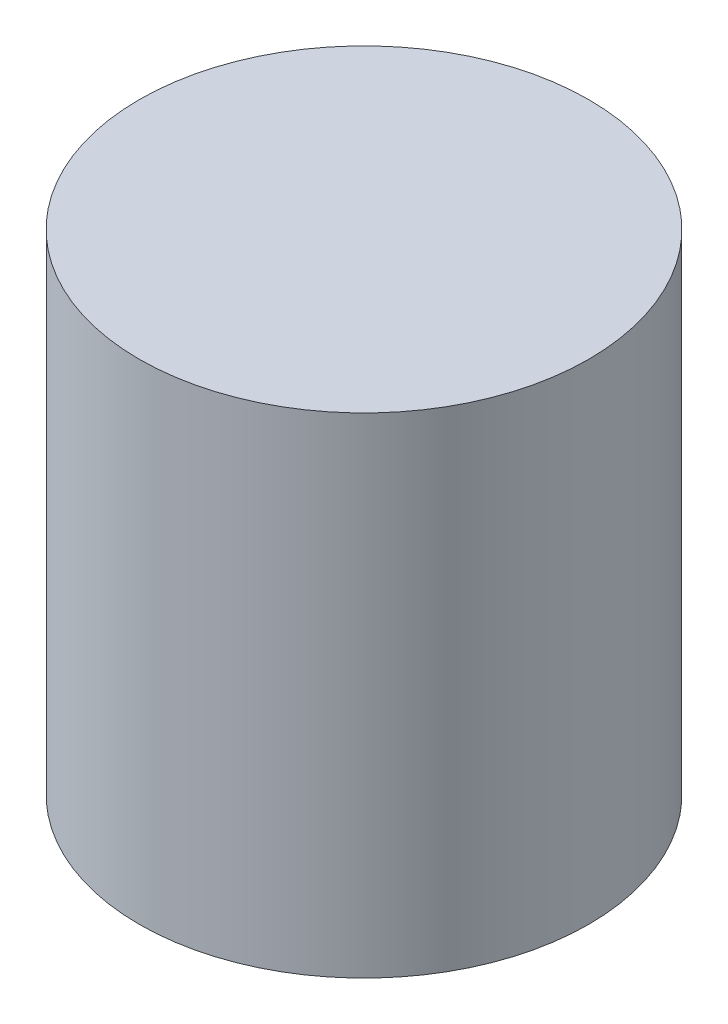
ISO-10303-21;
HEADER;
FILE_DESCRIPTION(('STEP AP214'),'2;1');
FILE_NAME('part.step','',(''),(''),'','','');
FILE_SCHEMA(('AUTOMOTIVE_DESIGN { 1 0 10303 214 1 1 1 1 }'));
ENDSEC;
DATA;
#1=APPLICATION_CONTEXT('core data for automotive mechanical design processes');
#2=APPLICATION_PROTOCOL_DEFINITION('international standard','automotive_design',2000,#1);
#3=PRODUCT_CONTEXT('',#1,'mechanical');
#4=PRODUCT('Part','Part','',(#3));
#5=PRODUCT_RELATED_PRODUCT_CATEGORY('part','',(#4));
#6=PRODUCT_DEFINITION_FORMATION('','',#4);
#7=PRODUCT_DEFINITION_CONTEXT('part definition',#1,'design');
#8=PRODUCT_DEFINITION('design','',#6,#7);
#9=PRODUCT_DEFINITION_SHAPE('','',#8);
#10=(LENGTH_UNIT() NAMED_UNIT(*) SI_UNIT(.MILLI.,.METRE.));
#11=(NAMED_UNIT(*) PLANE_ANGLE_UNIT() SI_UNIT($,.RADIAN.));
#12=(NAMED_UNIT(*) SI_UNIT($,.STERADIAN.) SOLID_ANGLE_UNIT());
#13=UNCERTAINTY_MEASURE_WITH_UNIT(LENGTH_MEASURE(1.E-05),#10,'distance_accuracy_value','');
#14=(GEOMETRIC_REPRESENTATION_CONTEXT(3) GLOBAL_UNCERTAINTY_ASSIGNED_CONTEXT((#13)) GLOBAL_UNIT_ASSIGNED_CONTEXT((#10,
#11,#12)) REPRESENTATION_CONTEXT('',''));
#15=CARTESIAN_POINT('',(0.,0.,0.));
#16=DIRECTION('',(0.,0.,1.));
#17=DIRECTION('',(1.,0.,0.));
#18=AXIS2_PLACEMENT_3D('',#15,#16,#17);
#19=CARTESIAN_POINT('',(-2.05,3.7,0.));
#20=DIRECTION('',(-1.,0.,0.));
#21=DIRECTION('',(0.,0.,1.));
#22=AXIS2_PLACEMENT_3D('',#19,#20,#21);
#23=PLANE('',#22);
#24=DIRECTION('',(0.,0.,-1.));
#25=VECTOR('',#24,1.);
#26=CARTESIAN_POINT('',(-2.05,0.,0.));
#27=LINE('',#26,#25);
#28=CARTESIAN_POINT('',(-2.05,0.,0.585));
#29=VERTEX_POINT('',#28);
#30=CARTESIAN_POINT('',(-2.05,0.,-0.585));
#31=VERTEX_POINT('',#30);
#32=EDGE_CURVE('E165',#29,#31,#27,.T.);
#33=ORIENTED_EDGE('',*,*,#32,.T.);
#34=DIRECTION('',(0.,-1.,0.));
#35=VECTOR('',#34,1.);
#36=CARTESIAN_POINT('',(-2.05,3.7,-0.585));
#37=LINE('',#36,#35);
#38=CARTESIAN_POINT('',(-2.05,3.7,-0.585));
#39=VERTEX_POINT('',#38);
#40=EDGE_CURVE('E11',#39,#31,#37,.T.);
#41=ORIENTED_EDGE('',*,*,#40,.F.);
#42=DIRECTION('',(0.,0.,-1.));
#43=VECTOR('',#42,1.);
#44=CARTESIAN_POINT('',(-2.05,3.7,0.));
#45=LINE('',#44,#43);
#46=CARTESIAN_POINT('',(-2.05,3.7,0.585));
#47=VERTEX_POINT('',#46);
#48=EDGE_CURVE('E191',#47,#39,#45,.T.);
#49=ORIENTED_EDGE('',*,*,#48,.F.);
#50=DIRECTION('',(0.,-1.,0.));
#51=VECTOR('',#50,1.);
#52=CARTESIAN_POINT('',(-2.05,3.7,0.585));
#53=LINE('',#52,#51);
#54=EDGE_CURVE('E164',#47,#29,#53,.T.);
#55=ORIENTED_EDGE('',*,*,#54,.T.);
#56=EDGE_LOOP('',(#33,#41,#49,#55));
#57=FACE_BOUND('',#56,.T.);
#58=ADVANCED_FACE('F34',(#57),#23,.F.);
#59=CARTESIAN_POINT('',(0.,3.7,-0.585));
#60=DIRECTION('',(0.,0.,-1.));
#61=DIRECTION('',(-1.,0.,0.));
#62=AXIS2_PLACEMENT_3D('',#59,#60,#61);
#63=PLANE('',#62);
#64=DIRECTION('',(1.,0.,0.));
#65=VECTOR('',#64,1.);
#66=CARTESIAN_POINT('',(0.,0.,-0.585));
#67=LINE('',#66,#65);
#68=CARTESIAN_POINT('',(-0.585,0.,-0.585));
#69=VERTEX_POINT('',#68);
#70=EDGE_CURVE('E168',#31,#69,#67,.T.);
#71=ORIENTED_EDGE('',*,*,#70,.T.);
#72=DIRECTION('',(0.,-1.,0.));
#73=VECTOR('',#72,1.);
#74=CARTESIAN_POINT('',(-0.585,3.7,-0.585));
#75=LINE('',#74,#73);
#76=CARTESIAN_POINT('',(-0.585,3.7,-0.585));
#77=VERTEX_POINT('',#76);
#78=EDGE_CURVE('E42',#77,#69,#75,.T.);
#79=ORIENTED_EDGE('',*,*,#78,.F.);
#80=DIRECTION('',(1.,0.,0.));
#81=VECTOR('',#80,1.);
#82=CARTESIAN_POINT('',(0.,3.7,-0.585));
#83=LINE('',#82,#81);
#84=EDGE_CURVE('E104',#39,#77,#83,.T.);
#85=ORIENTED_EDGE('',*,*,#84,.F.);
#86=ORIENTED_EDGE('',*,*,#40,.T.);
#87=EDGE_LOOP('',(#71,#79,#85,#86));
#88=FACE_BOUND('',#87,.T.);
#89=ADVANCED_FACE('F272',(#88),#63,.F.);
#90=CARTESIAN_POINT('',(-0.585,3.7,0.));
#91=DIRECTION('',(-1.,0.,0.));
#92=DIRECTION('',(0.,0.,1.));
#93=AXIS2_PLACEMENT_3D('',#90,#91,#92);
#94=PLANE('',#93);
#95=DIRECTION('',(0.,0.,-1.));
#96=VECTOR('',#95,1.);
#97=CARTESIAN_POINT('',(-0.585,0.,0.));
#98=LINE('',#97,#96);
#99=CARTESIAN_POINT('',(-0.585,0.,-2.05));
#100=VERTEX_POINT('',#99);
#101=EDGE_CURVE('E171',#69,#100,#98,.T.);
#102=ORIENTED_EDGE('',*,*,#101,.T.);
#103=DIRECTION('',(0.,-1.,0.));
#104=VECTOR('',#103,1.);
#105=CARTESIAN_POINT('',(-0.585,3.7,-2.05));
#106=LINE('',#105,#104);
#107=CARTESIAN_POINT('',(-0.585,3.7,-2.05));
#108=VERTEX_POINT('',#107);
#109=EDGE_CURVE('E208',#108,#100,#106,.T.);
#110=ORIENTED_EDGE('',*,*,#109,.F.);
#111=DIRECTION('',(0.,0.,-1.));
#112=VECTOR('',#111,1.);
#113=CARTESIAN_POINT('',(-0.585,3.7,0.));
#114=LINE('',#113,#112);
#115=EDGE_CURVE('E216',#77,#108,#114,.T.);
#116=ORIENTED_EDGE('',*,*,#115,.F.);
#117=ORIENTED_EDGE('',*,*,#78,.T.);
#118=EDGE_LOOP('',(#102,#110,#116,#117));
#119=FACE_BOUND('',#118,.T.);
#120=ADVANCED_FACE('F214',(#119),#94,.F.);
#121=CARTESIAN_POINT('',(0.,3.7,-2.05));
#122=DIRECTION('',(0.,0.,-1.));
#123=DIRECTION('',(-1.,0.,0.));
#124=AXIS2_PLACEMENT_3D('',#121,#122,#123);
#125=PLANE('',#124);
#126=DIRECTION('',(1.,0.,0.));
#127=VECTOR('',#126,1.);
#128=CARTESIAN_POINT('',(0.,0.,-2.05));
#129=LINE('',#128,#127);
#130=CARTESIAN_POINT('',(0.585,0.,-2.05));
#131=VERTEX_POINT('',#130);
#132=EDGE_CURVE('E173',#100,#131,#129,.T.);
#133=ORIENTED_EDGE('',*,*,#132,.T.);
#134=DIRECTION('',(0.,-1.,0.));
#135=VECTOR('',#134,1.);
#136=CARTESIAN_POINT('',(0.585,3.7,-2.05));
#137=LINE('',#136,#135);
#138=CARTESIAN_POINT('',(0.585,3.7,-2.05));
#139=VERTEX_POINT('',#138);
#140=EDGE_CURVE('E205',#139,#131,#137,.T.);
#141=ORIENTED_EDGE('',*,*,#140,.F.);
#142=DIRECTION('',(1.,0.,0.));
#143=VECTOR('',#142,1.);
#144=CARTESIAN_POINT('',(0.,3.7,-2.05));
#145=LINE('',#144,#143);
#146=EDGE_CURVE('E236',#108,#139,#145,.T.);
#147=ORIENTED_EDGE('',*,*,#146,.F.);
#148=ORIENTED_EDGE('',*,*,#109,.T.);
#149=EDGE_LOOP('',(#133,#141,#147,#148));
#150=FACE_BOUND('',#149,.T.);
#151=ADVANCED_FACE('F225',(#150),#125,.F.);
#152=CARTESIAN_POINT('',(0.585,3.7,0.));
#153=DIRECTION('',(1.,0.,0.));
#154=DIRECTION('',(0.,0.,-1.));
#155=AXIS2_PLACEMENT_3D('',#152,#153,#154);
#156=PLANE('',#155);
#157=DIRECTION('',(0.,0.,1.));
#158=VECTOR('',#157,1.);
#159=CARTESIAN_POINT('',(0.585,0.,0.));
#160=LINE('',#159,#158);
#161=CARTESIAN_POINT('',(0.585,0.,-0.585));
#162=VERTEX_POINT('',#161);
#163=EDGE_CURVE('E175',#131,#162,#160,.T.);
#164=ORIENTED_EDGE('',*,*,#163,.T.);
#165=DIRECTION('',(0.,-1.,0.));
#166=VECTOR('',#165,1.);
#167=CARTESIAN_POINT('',(0.585,3.7,-0.585));
#168=LINE('',#167,#166);
#169=CARTESIAN_POINT('',(0.585,3.7,-0.585));
#170=VERTEX_POINT('',#169);
#171=EDGE_CURVE('E202',#170,#162,#168,.T.);
#172=ORIENTED_EDGE('',*,*,#171,.F.);
#173=DIRECTION('',(0.,0.,1.));
#174=VECTOR('',#173,1.);
#175=CARTESIAN_POINT('',(0.585,3.7,0.));
#176=LINE('',#175,#174);
#177=EDGE_CURVE('E231',#139,#170,#176,.T.);
#178=ORIENTED_EDGE('',*,*,#177,.F.);
#179=ORIENTED_EDGE('',*,*,#140,.T.);
#180=EDGE_LOOP('',(#164,#172,#178,#179));
#181=FACE_BOUND('',#180,.T.);
#182=ADVANCED_FACE('F229',(#181),#156,.F.);
#183=CARTESIAN_POINT('',(0.,3.7,-0.585));
#184=DIRECTION('',(0.,0.,-1.));
#185=DIRECTION('',(-1.,0.,0.));
#186=AXIS2_PLACEMENT_3D('',#183,#184,#185);
#187=PLANE('',#186);
#188=DIRECTION('',(1.,0.,0.));
#189=VECTOR('',#188,1.);
#190=CARTESIAN_POINT('',(0.,0.,-0.585));
#191=LINE('',#190,#189);
#192=CARTESIAN_POINT('',(2.05,0.,-0.585));
#193=VERTEX_POINT('',#192);
#194=EDGE_CURVE('E177',#162,#193,#191,.T.);
#195=ORIENTED_EDGE('',*,*,#194,.T.);
#196=DIRECTION('',(0.,-1.,0.));
#197=VECTOR('',#196,1.);
#198=CARTESIAN_POINT('',(2.05,3.7,-0.585));
#199=LINE('',#198,#197);
#200=CARTESIAN_POINT('',(2.05,3.7,-0.585));
#201=VERTEX_POINT('',#200);
#202=EDGE_CURVE('E199',#201,#193,#199,.T.);
#203=ORIENTED_EDGE('',*,*,#202,.F.);
#204=DIRECTION('',(1.,0.,0.));
#205=VECTOR('',#204,1.);
#206=CARTESIAN_POINT('',(0.,3.7,-0.585));
#207=LINE('',#206,#205);
#208=EDGE_CURVE('E235',#170,#201,#207,.T.);
#209=ORIENTED_EDGE('',*,*,#208,.F.);
#210=ORIENTED_EDGE('',*,*,#171,.T.);
#211=EDGE_LOOP('',(#195,#203,#209,#210));
#212=FACE_BOUND('',#211,.T.);
#213=ADVANCED_FACE('F285',(#212),#187,.F.);
#214=CARTESIAN_POINT('',(2.05,3.7,0.));
#215=DIRECTION('',(1.,0.,0.));
#216=DIRECTION('',(0.,0.,-1.));
#217=AXIS2_PLACEMENT_3D('',#214,#215,#216);
#218=PLANE('',#217);
#219=DIRECTION('',(0.,0.,1.));
#220=VECTOR('',#219,1.);
#221=CARTESIAN_POINT('',(2.05,0.,0.));
#222=LINE('',#221,#220);
#223=CARTESIAN_POINT('',(2.05,0.,0.585));
#224=VERTEX_POINT('',#223);
#225=EDGE_CURVE('E179',#193,#224,#222,.T.);
#226=ORIENTED_EDGE('',*,*,#225,.T.);
#227=DIRECTION('',(0.,-1.,0.));
#228=VECTOR('',#227,1.);
#229=CARTESIAN_POINT('',(2.05,3.7,0.585));
#230=LINE('',#229,#228);
#231=CARTESIAN_POINT('',(2.05,3.7,0.585));
#232=VERTEX_POINT('',#231);
#233=EDGE_CURVE('E196',#232,#224,#230,.T.);
#234=ORIENTED_EDGE('',*,*,#233,.F.);
#235=DIRECTION('',(0.,0.,1.));
#236=VECTOR('',#235,1.);
#237=CARTESIAN_POINT('',(2.05,3.7,0.));
#238=LINE('',#237,#236);
#239=EDGE_CURVE('E157',#201,#232,#238,.T.);
#240=ORIENTED_EDGE('',*,*,#239,.F.);
#241=ORIENTED_EDGE('',*,*,#202,.T.);
#242=EDGE_LOOP('',(#226,#234,#240,#241));
#243=FACE_BOUND('',#242,.T.);
#244=ADVANCED_FACE('F244',(#243),#218,.F.);
#245=CARTESIAN_POINT('',(0.,3.7,0.585));
#246=DIRECTION('',(0.,0.,1.));
#247=DIRECTION('',(1.,0.,0.));
#248=AXIS2_PLACEMENT_3D('',#245,#246,#247);
#249=PLANE('',#248);
#250=DIRECTION('',(-1.,0.,0.));
#251=VECTOR('',#250,1.);
#252=CARTESIAN_POINT('',(0.,0.,0.585));
#253=LINE('',#252,#251);
#254=CARTESIAN_POINT('',(0.585,0.,0.585));
#255=VERTEX_POINT('',#254);
#256=EDGE_CURVE('E181',#224,#255,#253,.T.);
#257=ORIENTED_EDGE('',*,*,#256,.T.);
#258=DIRECTION('',(0.,-1.,0.));
#259=VECTOR('',#258,1.);
#260=CARTESIAN_POINT('',(0.585,3.7,0.585));
#261=LINE('',#260,#259);
#262=CARTESIAN_POINT('',(0.585,3.7,0.585));
#263=VERTEX_POINT('',#262);
#264=EDGE_CURVE('E141',#263,#255,#261,.T.);
#265=ORIENTED_EDGE('',*,*,#264,.F.);
#266=DIRECTION('',(-1.,0.,0.));
#267=VECTOR('',#266,1.);
#268=CARTESIAN_POINT('',(0.,3.7,0.585));
#269=LINE('',#268,#267);
#270=EDGE_CURVE('E155',#232,#263,#269,.T.);
#271=ORIENTED_EDGE('',*,*,#270,.F.);
#272=ORIENTED_EDGE('',*,*,#233,.T.);
#273=EDGE_LOOP('',(#257,#265,#271,#272));
#274=FACE_BOUND('',#273,.T.);
#275=ADVANCED_FACE('F248',(#274),#249,.F.);
#276=CARTESIAN_POINT('',(0.585,3.7,0.));
#277=DIRECTION('',(1.,0.,0.));
#278=DIRECTION('',(0.,0.,-1.));
#279=AXIS2_PLACEMENT_3D('',#276,#277,#278);
#280=PLANE('',#279);
#281=DIRECTION('',(0.,0.,1.));
#282=VECTOR('',#281,1.);
#283=CARTESIAN_POINT('',(0.585,0.,0.));
#284=LINE('',#283,#282);
#285=CARTESIAN_POINT('',(0.585,0.,2.05));
#286=VERTEX_POINT('',#285);
#287=EDGE_CURVE('E138',#255,#286,#284,.T.);
#288=ORIENTED_EDGE('',*,*,#287,.T.);
#289=DIRECTION('',(0.,-1.,0.));
#290=VECTOR('',#289,1.);
#291=CARTESIAN_POINT('',(0.585,3.7,2.05));
#292=LINE('',#291,#290);
#293=CARTESIAN_POINT('',(0.585,3.7,2.05));
#294=VERTEX_POINT('',#293);
#295=EDGE_CURVE('E130',#294,#286,#292,.T.);
#296=ORIENTED_EDGE('',*,*,#295,.F.);
#297=DIRECTION('',(0.,0.,1.));
#298=VECTOR('',#297,1.);
#299=CARTESIAN_POINT('',(0.585,3.7,0.));
#300=LINE('',#299,#298);
#301=EDGE_CURVE('E135',#263,#294,#300,.T.);
#302=ORIENTED_EDGE('',*,*,#301,.F.);
#303=ORIENTED_EDGE('',*,*,#264,.T.);
#304=EDGE_LOOP('',(#288,#296,#302,#303));
#305=FACE_BOUND('',#304,.T.);
#306=ADVANCED_FACE('F132',(#305),#280,.F.);
#307=CARTESIAN_POINT('',(0.,3.7,2.05));
#308=DIRECTION('',(0.,0.,1.));
#309=DIRECTION('',(1.,0.,0.));
#310=AXIS2_PLACEMENT_3D('',#307,#308,#309);
#311=PLANE('',#310);
#312=DIRECTION('',(-1.,0.,0.));
#313=VECTOR('',#312,1.);
#314=CARTESIAN_POINT('',(0.,0.,2.05));
#315=LINE('',#314,#313);
#316=CARTESIAN_POINT('',(-0.585,0.,2.05));
#317=VERTEX_POINT('',#316);
#318=EDGE_CURVE('E184',#286,#317,#315,.T.);
#319=ORIENTED_EDGE('',*,*,#318,.T.);
#320=DIRECTION('',(0.,-1.,0.));
#321=VECTOR('',#320,1.);
#322=CARTESIAN_POINT('',(-0.585,3.7,2.05));
#323=LINE('',#322,#321);
#324=CARTESIAN_POINT('',(-0.585,3.7,2.05));
#325=VERTEX_POINT('',#324);
#326=EDGE_CURVE('E142',#325,#317,#323,.T.);
#327=ORIENTED_EDGE('',*,*,#326,.F.);
#328=DIRECTION('',(-1.,0.,0.));
#329=VECTOR('',#328,1.);
#330=CARTESIAN_POINT('',(0.,3.7,2.05));
#331=LINE('',#330,#329);
#332=EDGE_CURVE('E145',#294,#325,#331,.T.);
#333=ORIENTED_EDGE('',*,*,#332,.F.);
#334=ORIENTED_EDGE('',*,*,#295,.T.);
#335=EDGE_LOOP('',(#319,#327,#333,#334));
#336=FACE_BOUND('',#335,.T.);
#337=ADVANCED_FACE('F146',(#336),#311,.F.);
#338=CARTESIAN_POINT('',(-0.585,3.7,0.));
#339=DIRECTION('',(-1.,0.,0.));
#340=DIRECTION('',(0.,0.,1.));
#341=AXIS2_PLACEMENT_3D('',#338,#339,#340);
#342=PLANE('',#341);
#343=DIRECTION('',(0.,0.,-1.));
#344=VECTOR('',#343,1.);
#345=CARTESIAN_POINT('',(-0.585,0.,0.));
#346=LINE('',#345,#344);
#347=CARTESIAN_POINT('',(-0.585,0.,0.585));
#348=VERTEX_POINT('',#347);
#349=EDGE_CURVE('E90',#317,#348,#346,.T.);
#350=ORIENTED_EDGE('',*,*,#349,.T.);
#351=DIRECTION('',(0.,-1.,0.));
#352=VECTOR('',#351,1.);
#353=CARTESIAN_POINT('',(-0.585,3.7,0.585));
#354=LINE('',#353,#352);
#355=CARTESIAN_POINT('',(-0.585,3.7,0.585));
#356=VERTEX_POINT('',#355);
#357=EDGE_CURVE('E50',#356,#348,#354,.T.);
#358=ORIENTED_EDGE('',*,*,#357,.F.);
#359=DIRECTION('',(0.,0.,-1.));
#360=VECTOR('',#359,1.);
#361=CARTESIAN_POINT('',(-0.585,3.7,0.));
#362=LINE('',#361,#360);
#363=EDGE_CURVE('E149',#325,#356,#362,.T.);
#364=ORIENTED_EDGE('',*,*,#363,.F.);
#365=ORIENTED_EDGE('',*,*,#326,.T.);
#366=EDGE_LOOP('',(#350,#358,#364,#365));
#367=FACE_BOUND('',#366,.T.);
#368=ADVANCED_FACE('F249',(#367),#342,.F.);
#369=CARTESIAN_POINT('',(0.,3.7,0.585));
#370=DIRECTION('',(0.,0.,1.));
#371=DIRECTION('',(1.,0.,0.));
#372=AXIS2_PLACEMENT_3D('',#369,#370,#371);
#373=PLANE('',#372);
#374=DIRECTION('',(-1.,0.,0.));
#375=VECTOR('',#374,1.);
#376=CARTESIAN_POINT('',(0.,0.,0.585));
#377=LINE('',#376,#375);
#378=EDGE_CURVE('E96',#348,#29,#377,.T.);
#379=ORIENTED_EDGE('',*,*,#378,.T.);
#380=ORIENTED_EDGE('',*,*,#54,.F.);
#381=DIRECTION('',(-1.,0.,0.));
#382=VECTOR('',#381,1.);
#383=CARTESIAN_POINT('',(0.,3.7,0.585));
#384=LINE('',#383,#382);
#385=EDGE_CURVE('E162',#356,#47,#384,.T.);
#386=ORIENTED_EDGE('',*,*,#385,.F.);
#387=ORIENTED_EDGE('',*,*,#357,.T.);
#388=EDGE_LOOP('',(#379,#380,#386,#387));
#389=FACE_BOUND('',#388,.T.);
#390=ADVANCED_FACE('F252',(#389),#373,.F.);
#391=CARTESIAN_POINT('',(0.,3.7,0.));
#392=DIRECTION('',(0.,-1.,0.));
#393=DIRECTION('',(0.,0.,-1.));
#394=AXIS2_PLACEMENT_3D('',#391,#392,#393);
#395=CYLINDRICAL_SURFACE('',#394,2.7559);
#396=CARTESIAN_POINT('',(0.,0.,0.));
#397=DIRECTION('',(0.,1.,0.));
#398=DIRECTION('',(0.,0.,1.));
#399=AXIS2_PLACEMENT_3D('',#396,#397,#398);
#400=CIRCLE('',#399,2.7559);
#401=CARTESIAN_POINT('',(0.,0.,2.7559));
#402=VERTEX_POINT('',#401);
#403=EDGE_CURVE('E188',#402,#402,#400,.T.);
#404=ORIENTED_EDGE('',*,*,#403,.T.);
#405=EDGE_LOOP('',(#404));
#406=FACE_BOUND('',#405,.T.);
#407=CARTESIAN_POINT('',(0.,6.,0.));
#408=DIRECTION('',(0.,1.,0.));
#409=DIRECTION('',(0.,0.,1.));
#410=AXIS2_PLACEMENT_3D('',#407,#408,#409);
#411=CIRCLE('',#410,2.7559);
#412=CARTESIAN_POINT('',(0.,6.,2.7559));
#413=VERTEX_POINT('',#412);
#414=EDGE_CURVE('E169',#413,#413,#411,.T.);
#415=ORIENTED_EDGE('',*,*,#414,.F.);
#416=EDGE_LOOP('',(#415));
#417=FACE_BOUND('',#416,.T.);
#418=ADVANCED_FACE('F261',(#406,#417),#395,.T.);
#419=CARTESIAN_POINT('',(0.,0.,0.));
#420=DIRECTION('',(0.,1.,0.));
#421=DIRECTION('',(0.,0.,1.));
#422=AXIS2_PLACEMENT_3D('',#419,#420,#421);
#423=PLANE('',#422);
#424=ORIENTED_EDGE('',*,*,#32,.F.);
#425=ORIENTED_EDGE('',*,*,#378,.F.);
#426=ORIENTED_EDGE('',*,*,#349,.F.);
#427=ORIENTED_EDGE('',*,*,#318,.F.);
#428=ORIENTED_EDGE('',*,*,#287,.F.);
#429=ORIENTED_EDGE('',*,*,#256,.F.);
#430=ORIENTED_EDGE('',*,*,#225,.F.);
#431=ORIENTED_EDGE('',*,*,#194,.F.);
#432=ORIENTED_EDGE('',*,*,#163,.F.);
#433=ORIENTED_EDGE('',*,*,#132,.F.);
#434=ORIENTED_EDGE('',*,*,#101,.F.);
#435=ORIENTED_EDGE('',*,*,#70,.F.);
#436=EDGE_LOOP('',(#424,#425,#426,#427,#428,#429,#430,#431,#432,#433,#434,#435));
#437=FACE_BOUND('',#436,.T.);
#438=ORIENTED_EDGE('',*,*,#403,.F.);
#439=EDGE_LOOP('',(#438));
#440=FACE_BOUND('',#439,.T.);
#441=ADVANCED_FACE('F220',(#437,#440),#423,.F.);
#442=CARTESIAN_POINT('',(0.,6.,0.));
#443=DIRECTION('',(0.,1.,0.));
#444=DIRECTION('',(0.,0.,1.));
#445=AXIS2_PLACEMENT_3D('',#442,#443,#444);
#446=PLANE('',#445);
#447=ORIENTED_EDGE('',*,*,#414,.T.);
#448=EDGE_LOOP('',(#447));
#449=FACE_BOUND('',#448,.T.);
#450=ADVANCED_FACE('F259',(#449),#446,.T.);
#451=CARTESIAN_POINT('',(0.,3.7,0.));
#452=DIRECTION('',(0.,1.,0.));
#453=DIRECTION('',(0.,0.,1.));
#454=AXIS2_PLACEMENT_3D('',#451,#452,#453);
#455=PLANE('',#454);
#456=ORIENTED_EDGE('',*,*,#385,.T.);
#457=ORIENTED_EDGE('',*,*,#48,.T.);
#458=ORIENTED_EDGE('',*,*,#84,.T.);
#459=ORIENTED_EDGE('',*,*,#115,.T.);
#460=ORIENTED_EDGE('',*,*,#146,.T.);
#461=ORIENTED_EDGE('',*,*,#177,.T.);
#462=ORIENTED_EDGE('',*,*,#208,.T.);
#463=ORIENTED_EDGE('',*,*,#239,.T.);
#464=ORIENTED_EDGE('',*,*,#270,.T.);
#465=ORIENTED_EDGE('',*,*,#301,.T.);
#466=ORIENTED_EDGE('',*,*,#332,.T.);
#467=ORIENTED_EDGE('',*,*,#363,.T.);
#468=EDGE_LOOP('',(#456,#457,#458,#459,#460,#461,#462,#463,#464,#465,#466,#467));
#469=FACE_BOUND('',#468,.T.);
#470=ADVANCED_FACE('F152',(#469),#455,.F.);
#471=CLOSED_SHELL('',(#58,#89,#120,#151,#182,#213,#244,#275,#306,#337,#368,#390,#418,#441,#450,#470));
#472=MANIFOLD_SOLID_BREP('B2',#471);
#473=ADVANCED_BREP_SHAPE_REPRESENTATION('',(#18,#472),#14);
#474=SHAPE_DEFINITION_REPRESENTATION(#9,#473);
ENDSEC;
END-ISO-10303-21;
